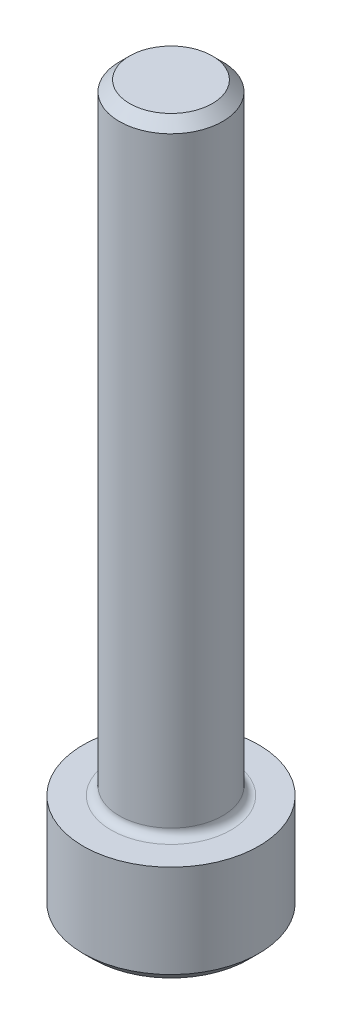
ISO-10303-21;
HEADER;
FILE_DESCRIPTION(('STEP AP214'),'2;1');
FILE_NAME('part.step','',(''),(''),'','','');
FILE_SCHEMA(('AUTOMOTIVE_DESIGN { 1 0 10303 214 1 1 1 1 }'));
ENDSEC;
DATA;
#1=APPLICATION_CONTEXT('core data for automotive mechanical design processes');
#2=APPLICATION_PROTOCOL_DEFINITION('international standard','automotive_design',2000,#1);
#3=PRODUCT_CONTEXT('',#1,'mechanical');
#4=PRODUCT('Part','Part','',(#3));
#5=PRODUCT_RELATED_PRODUCT_CATEGORY('part','',(#4));
#6=PRODUCT_DEFINITION_FORMATION('','',#4);
#7=PRODUCT_DEFINITION_CONTEXT('part definition',#1,'design');
#8=PRODUCT_DEFINITION('design','',#6,#7);
#9=PRODUCT_DEFINITION_SHAPE('','',#8);
#10=(LENGTH_UNIT() NAMED_UNIT(*) SI_UNIT(.MILLI.,.METRE.));
#11=(NAMED_UNIT(*) PLANE_ANGLE_UNIT() SI_UNIT($,.RADIAN.));
#12=(NAMED_UNIT(*) SI_UNIT($,.STERADIAN.) SOLID_ANGLE_UNIT());
#13=UNCERTAINTY_MEASURE_WITH_UNIT(LENGTH_MEASURE(1.E-05),#10,'distance_accuracy_value','');
#14=(GEOMETRIC_REPRESENTATION_CONTEXT(3) GLOBAL_UNCERTAINTY_ASSIGNED_CONTEXT((#13)) GLOBAL_UNIT_ASSIGNED_CONTEXT((#10,
#11,#12)) REPRESENTATION_CONTEXT('',''));
#15=CARTESIAN_POINT('',(0.,0.,0.));
#16=DIRECTION('',(0.,0.,1.));
#17=DIRECTION('',(1.,0.,0.));
#18=AXIS2_PLACEMENT_3D('',#15,#16,#17);
#19=CARTESIAN_POINT('',(0.,30.,0.));
#20=DIRECTION('',(0.,-1.,0.));
#21=DIRECTION('',(0.,0.,-1.));
#22=AXIS2_PLACEMENT_3D('',#19,#20,#21);
#23=CYLINDRICAL_SURFACE('',#22,2.5);
#24=CARTESIAN_POINT('',(0.,29.5,0.));
#25=DIRECTION('',(0.,1.,0.));
#26=DIRECTION('',(0.,0.,1.));
#27=AXIS2_PLACEMENT_3D('',#24,#25,#26);
#28=CIRCLE('',#27,2.5);
#29=CARTESIAN_POINT('',(0.,29.5,2.5));
#30=VERTEX_POINT('',#29);
#31=EDGE_CURVE('E11',#30,#30,#28,.F.);
#32=ORIENTED_EDGE('',*,*,#31,.T.);
#33=EDGE_LOOP('',(#32));
#34=FACE_BOUND('',#33,.T.);
#35=CARTESIAN_POINT('',(0.,0.400000000000001,0.));
#36=DIRECTION('',(0.,1.,0.));
#37=DIRECTION('',(0.,0.,1.));
#38=AXIS2_PLACEMENT_3D('',#35,#36,#37);
#39=CIRCLE('',#38,2.5);
#40=CARTESIAN_POINT('',(0.,0.400000000000001,2.5));
#41=VERTEX_POINT('',#40);
#42=EDGE_CURVE('E145',#41,#41,#39,.T.);
#43=ORIENTED_EDGE('',*,*,#42,.T.);
#44=EDGE_LOOP('',(#43));
#45=FACE_BOUND('',#44,.T.);
#46=ADVANCED_FACE('F35',(#34,#45),#23,.T.);
#47=CARTESIAN_POINT('',(0.,30.,0.));
#48=DIRECTION('',(0.,1.,0.));
#49=DIRECTION('',(0.,0.,1.));
#50=AXIS2_PLACEMENT_3D('',#47,#48,#49);
#51=PLANE('',#50);
#52=CARTESIAN_POINT('',(0.,30.,0.));
#53=DIRECTION('',(0.,1.,0.));
#54=DIRECTION('',(0.,0.,1.));
#55=AXIS2_PLACEMENT_3D('',#52,#53,#54);
#56=CIRCLE('',#55,1.99999999999999);
#57=CARTESIAN_POINT('',(0.,30.,1.99999999999999));
#58=VERTEX_POINT('',#57);
#59=EDGE_CURVE('E43',#58,#58,#56,.T.);
#60=ORIENTED_EDGE('',*,*,#59,.T.);
#61=EDGE_LOOP('',(#60));
#62=FACE_BOUND('',#61,.T.);
#63=ADVANCED_FACE('F159',(#62),#51,.T.);
#64=CARTESIAN_POINT('',(0.,-5.,0.));
#65=DIRECTION('',(0.,1.,0.));
#66=DIRECTION('',(0.,0.,1.));
#67=AXIS2_PLACEMENT_3D('',#64,#65,#66);
#68=CYLINDRICAL_SURFACE('',#67,4.25);
#69=CARTESIAN_POINT('',(0.,-4.49999999999999,0.));
#70=DIRECTION('',(0.,1.,0.));
#71=DIRECTION('',(0.,0.,1.));
#72=AXIS2_PLACEMENT_3D('',#69,#70,#71);
#73=CIRCLE('',#72,4.25);
#74=CARTESIAN_POINT('',(0.,-4.49999999999999,4.25));
#75=VERTEX_POINT('',#74);
#76=EDGE_CURVE('E151',#75,#75,#73,.T.);
#77=ORIENTED_EDGE('',*,*,#76,.T.);
#78=EDGE_LOOP('',(#77));
#79=FACE_BOUND('',#78,.T.);
#80=CARTESIAN_POINT('',(0.,0.,0.));
#81=DIRECTION('',(0.,1.,0.));
#82=DIRECTION('',(0.,0.,1.));
#83=AXIS2_PLACEMENT_3D('',#80,#81,#82);
#84=CIRCLE('',#83,4.25);
#85=CARTESIAN_POINT('',(0.,0.,4.25));
#86=VERTEX_POINT('',#85);
#87=EDGE_CURVE('E137',#86,#86,#84,.T.);
#88=ORIENTED_EDGE('',*,*,#87,.F.);
#89=EDGE_LOOP('',(#88));
#90=FACE_BOUND('',#89,.T.);
#91=ADVANCED_FACE('F180',(#79,#90),#68,.T.);
#92=CARTESIAN_POINT('',(0.,-5.,0.));
#93=DIRECTION('',(0.,1.,0.));
#94=DIRECTION('',(0.,0.,1.));
#95=AXIS2_PLACEMENT_3D('',#92,#93,#94);
#96=PLANE('',#95);
#97=DIRECTION('',(-0.866025403784439,0.,-0.5));
#98=VECTOR('',#97,1.);
#99=CARTESIAN_POINT('',(0.,-5.,2.3094010767585));
#100=LINE('',#99,#98);
#101=CARTESIAN_POINT('',(0.,-5.,2.3094010767585));
#102=VERTEX_POINT('',#101);
#103=CARTESIAN_POINT('',(-2.,-5.,1.15470053837925));
#104=VERTEX_POINT('',#103);
#105=EDGE_CURVE('E124',#102,#104,#100,.T.);
#106=ORIENTED_EDGE('',*,*,#105,.F.);
#107=DIRECTION('',(-0.866025403784439,0.,0.5));
#108=VECTOR('',#107,1.);
#109=CARTESIAN_POINT('',(2.,-5.,1.15470053837925));
#110=LINE('',#109,#108);
#111=CARTESIAN_POINT('',(2.,-5.,1.15470053837925));
#112=VERTEX_POINT('',#111);
#113=EDGE_CURVE('E50',#112,#102,#110,.T.);
#114=ORIENTED_EDGE('',*,*,#113,.F.);
#115=DIRECTION('',(0.,0.,1.));
#116=VECTOR('',#115,1.);
#117=CARTESIAN_POINT('',(2.,-5.,-1.15470053837925));
#118=LINE('',#117,#116);
#119=CARTESIAN_POINT('',(2.,-5.,-1.15470053837925));
#120=VERTEX_POINT('',#119);
#121=EDGE_CURVE('E133',#120,#112,#118,.T.);
#122=ORIENTED_EDGE('',*,*,#121,.F.);
#123=DIRECTION('',(0.866025403784439,0.,0.5));
#124=VECTOR('',#123,1.);
#125=CARTESIAN_POINT('',(0.,-5.,-2.3094010767585));
#126=LINE('',#125,#124);
#127=CARTESIAN_POINT('',(0.,-5.,-2.3094010767585));
#128=VERTEX_POINT('',#127);
#129=EDGE_CURVE('E131',#128,#120,#126,.T.);
#130=ORIENTED_EDGE('',*,*,#129,.F.);
#131=DIRECTION('',(0.866025403784439,0.,-0.5));
#132=VECTOR('',#131,1.);
#133=CARTESIAN_POINT('',(-2.,-5.,-1.15470053837925));
#134=LINE('',#133,#132);
#135=CARTESIAN_POINT('',(-2.,-5.,-1.15470053837925));
#136=VERTEX_POINT('',#135);
#137=EDGE_CURVE('E98',#136,#128,#134,.T.);
#138=ORIENTED_EDGE('',*,*,#137,.F.);
#139=DIRECTION('',(0.,0.,-1.));
#140=VECTOR('',#139,1.);
#141=CARTESIAN_POINT('',(-2.,-5.,1.15470053837925));
#142=LINE('',#141,#140);
#143=EDGE_CURVE('E127',#104,#136,#142,.T.);
#144=ORIENTED_EDGE('',*,*,#143,.F.);
#145=EDGE_LOOP('',(#106,#114,#122,#130,#138,#144));
#146=FACE_BOUND('',#145,.T.);
#147=CARTESIAN_POINT('',(0.,-5.,0.));
#148=DIRECTION('',(0.,1.,0.));
#149=DIRECTION('',(0.,0.,1.));
#150=AXIS2_PLACEMENT_3D('',#147,#148,#149);
#151=CIRCLE('',#150,3.74999999999999);
#152=CARTESIAN_POINT('',(0.,-5.,3.74999999999999));
#153=VERTEX_POINT('',#152);
#154=EDGE_CURVE('E154',#153,#153,#151,.F.);
#155=ORIENTED_EDGE('',*,*,#154,.T.);
#156=EDGE_LOOP('',(#155));
#157=FACE_BOUND('',#156,.T.);
#158=ADVANCED_FACE('F191',(#146,#157),#96,.F.);
#159=CARTESIAN_POINT('',(0.,0.,0.));
#160=DIRECTION('',(0.,1.,0.));
#161=DIRECTION('',(0.,0.,1.));
#162=AXIS2_PLACEMENT_3D('',#159,#160,#161);
#163=PLANE('',#162);
#164=CARTESIAN_POINT('',(0.,0.,0.));
#165=DIRECTION('',(0.,1.,0.));
#166=DIRECTION('',(0.,0.,1.));
#167=AXIS2_PLACEMENT_3D('',#164,#165,#166);
#168=CIRCLE('',#167,2.9);
#169=CARTESIAN_POINT('',(0.,0.,2.9));
#170=VERTEX_POINT('',#169);
#171=EDGE_CURVE('E148',#170,#170,#168,.F.);
#172=ORIENTED_EDGE('',*,*,#171,.T.);
#173=EDGE_LOOP('',(#172));
#174=FACE_BOUND('',#173,.T.);
#175=ORIENTED_EDGE('',*,*,#87,.T.);
#176=EDGE_LOOP('',(#175));
#177=FACE_BOUND('',#176,.T.);
#178=ADVANCED_FACE('F186',(#174,#177),#163,.T.);
#179=CARTESIAN_POINT('',(0.,0.400000000000001,0.));
#180=DIRECTION('',(0.,1.,0.));
#181=DIRECTION('',(0.,0.,1.));
#182=AXIS2_PLACEMENT_3D('',#179,#180,#181);
#183=TOROIDAL_SURFACE('',#182,2.9,0.4);
#184=ORIENTED_EDGE('',*,*,#171,.F.);
#185=EDGE_LOOP('',(#184));
#186=FACE_BOUND('',#185,.T.);
#187=ORIENTED_EDGE('',*,*,#42,.F.);
#188=EDGE_LOOP('',(#187));
#189=FACE_BOUND('',#188,.T.);
#190=ADVANCED_FACE('F171',(#186,#189),#183,.F.);
#191=CARTESIAN_POINT('',(0.,-4.49999999999999,0.));
#192=DIRECTION('',(0.,1.,0.));
#193=DIRECTION('',(0.,0.,1.));
#194=AXIS2_PLACEMENT_3D('',#191,#192,#193);
#195=CONICAL_SURFACE('',#194,4.25,0.785398163397449);
#196=ORIENTED_EDGE('',*,*,#154,.F.);
#197=EDGE_LOOP('',(#196));
#198=FACE_BOUND('',#197,.T.);
#199=ORIENTED_EDGE('',*,*,#76,.F.);
#200=EDGE_LOOP('',(#199));
#201=FACE_BOUND('',#200,.T.);
#202=ADVANCED_FACE('F163',(#198,#201),#195,.T.);
#203=CARTESIAN_POINT('',(0.,30.,0.));
#204=DIRECTION('',(0.,-1.,0.));
#205=DIRECTION('',(0.,0.,-1.));
#206=AXIS2_PLACEMENT_3D('',#203,#204,#205);
#207=CONICAL_SURFACE('',#206,1.99999999999999,0.78539816339745);
#208=ORIENTED_EDGE('',*,*,#31,.F.);
#209=EDGE_LOOP('',(#208));
#210=FACE_BOUND('',#209,.T.);
#211=ORIENTED_EDGE('',*,*,#59,.F.);
#212=EDGE_LOOP('',(#211));
#213=FACE_BOUND('',#212,.T.);
#214=ADVANCED_FACE('F37',(#210,#213),#207,.T.);
#215=CARTESIAN_POINT('',(2.,-2.5,1.15470053837925));
#216=DIRECTION('',(0.5,0.,0.866025403784439));
#217=DIRECTION('',(0.866025403784439,0.,-0.5));
#218=AXIS2_PLACEMENT_3D('',#215,#216,#217);
#219=PLANE('',#218);
#220=ORIENTED_EDGE('',*,*,#113,.T.);
#221=DIRECTION('',(0.,-1.,0.));
#222=VECTOR('',#221,1.);
#223=CARTESIAN_POINT('',(0.,-2.5,2.3094010767585));
#224=LINE('',#223,#222);
#225=CARTESIAN_POINT('',(0.,-2.5,2.3094010767585));
#226=VERTEX_POINT('',#225);
#227=EDGE_CURVE('E80',#226,#102,#224,.T.);
#228=ORIENTED_EDGE('',*,*,#227,.F.);
#229=DIRECTION('',(-0.866025403784439,0.,0.5));
#230=VECTOR('',#229,1.);
#231=CARTESIAN_POINT('',(2.,-2.5,1.15470053837925));
#232=LINE('',#231,#230);
#233=CARTESIAN_POINT('',(2.,-2.5,1.15470053837925));
#234=VERTEX_POINT('',#233);
#235=EDGE_CURVE('E135',#234,#226,#232,.T.);
#236=ORIENTED_EDGE('',*,*,#235,.F.);
#237=DIRECTION('',(0.,-1.,0.));
#238=VECTOR('',#237,1.);
#239=CARTESIAN_POINT('',(2.,-2.5,1.15470053837925));
#240=LINE('',#239,#238);
#241=EDGE_CURVE('E58',#234,#112,#240,.T.);
#242=ORIENTED_EDGE('',*,*,#241,.T.);
#243=EDGE_LOOP('',(#220,#228,#236,#242));
#244=FACE_BOUND('',#243,.T.);
#245=ADVANCED_FACE('F162',(#244),#219,.F.);
#246=CARTESIAN_POINT('',(2.,-2.5,-1.15470053837925));
#247=DIRECTION('',(1.,0.,0.));
#248=DIRECTION('',(0.,0.,-1.));
#249=AXIS2_PLACEMENT_3D('',#246,#247,#248);
#250=PLANE('',#249);
#251=ORIENTED_EDGE('',*,*,#121,.T.);
#252=ORIENTED_EDGE('',*,*,#241,.F.);
#253=DIRECTION('',(0.,0.,1.));
#254=VECTOR('',#253,1.);
#255=CARTESIAN_POINT('',(2.,-2.5,-1.15470053837925));
#256=LINE('',#255,#254);
#257=CARTESIAN_POINT('',(2.,-2.5,-1.15470053837925));
#258=VERTEX_POINT('',#257);
#259=EDGE_CURVE('E110',#258,#234,#256,.T.);
#260=ORIENTED_EDGE('',*,*,#259,.F.);
#261=DIRECTION('',(0.,-1.,0.));
#262=VECTOR('',#261,1.);
#263=CARTESIAN_POINT('',(2.,-2.5,-1.15470053837925));
#264=LINE('',#263,#262);
#265=EDGE_CURVE('E102',#258,#120,#264,.T.);
#266=ORIENTED_EDGE('',*,*,#265,.T.);
#267=EDGE_LOOP('',(#251,#252,#260,#266));
#268=FACE_BOUND('',#267,.T.);
#269=ADVANCED_FACE('F169',(#268),#250,.F.);
#270=CARTESIAN_POINT('',(0.,-2.5,-2.3094010767585));
#271=DIRECTION('',(0.5,0.,-0.866025403784439));
#272=DIRECTION('',(-0.866025403784439,0.,-0.5));
#273=AXIS2_PLACEMENT_3D('',#270,#271,#272);
#274=PLANE('',#273);
#275=ORIENTED_EDGE('',*,*,#129,.T.);
#276=ORIENTED_EDGE('',*,*,#265,.F.);
#277=DIRECTION('',(0.866025403784439,0.,0.5));
#278=VECTOR('',#277,1.);
#279=CARTESIAN_POINT('',(0.,-2.5,-2.3094010767585));
#280=LINE('',#279,#278);
#281=CARTESIAN_POINT('',(0.,-2.5,-2.3094010767585));
#282=VERTEX_POINT('',#281);
#283=EDGE_CURVE('E106',#282,#258,#280,.T.);
#284=ORIENTED_EDGE('',*,*,#283,.F.);
#285=DIRECTION('',(0.,-1.,0.));
#286=VECTOR('',#285,1.);
#287=CARTESIAN_POINT('',(0.,-2.5,-2.3094010767585));
#288=LINE('',#287,#286);
#289=EDGE_CURVE('E91',#282,#128,#288,.T.);
#290=ORIENTED_EDGE('',*,*,#289,.T.);
#291=EDGE_LOOP('',(#275,#276,#284,#290));
#292=FACE_BOUND('',#291,.T.);
#293=ADVANCED_FACE('F107',(#292),#274,.F.);
#294=CARTESIAN_POINT('',(-2.,-2.5,-1.15470053837925));
#295=DIRECTION('',(-0.5,0.,-0.866025403784439));
#296=DIRECTION('',(-0.866025403784439,0.,0.5));
#297=AXIS2_PLACEMENT_3D('',#294,#295,#296);
#298=PLANE('',#297);
#299=ORIENTED_EDGE('',*,*,#137,.T.);
#300=ORIENTED_EDGE('',*,*,#289,.F.);
#301=DIRECTION('',(0.866025403784439,0.,-0.5));
#302=VECTOR('',#301,1.);
#303=CARTESIAN_POINT('',(-2.,-2.5,-1.15470053837925));
#304=LINE('',#303,#302);
#305=CARTESIAN_POINT('',(-2.,-2.5,-1.15470053837925));
#306=VERTEX_POINT('',#305);
#307=EDGE_CURVE('E95',#306,#282,#304,.T.);
#308=ORIENTED_EDGE('',*,*,#307,.F.);
#309=DIRECTION('',(0.,-1.,0.));
#310=VECTOR('',#309,1.);
#311=CARTESIAN_POINT('',(-2.,-2.5,-1.15470053837925));
#312=LINE('',#311,#310);
#313=EDGE_CURVE('E103',#306,#136,#312,.T.);
#314=ORIENTED_EDGE('',*,*,#313,.T.);
#315=EDGE_LOOP('',(#299,#300,#308,#314));
#316=FACE_BOUND('',#315,.T.);
#317=ADVANCED_FACE('F93',(#316),#298,.F.);
#318=CARTESIAN_POINT('',(-2.,-2.5,1.15470053837925));
#319=DIRECTION('',(-1.,0.,0.));
#320=DIRECTION('',(0.,0.,1.));
#321=AXIS2_PLACEMENT_3D('',#318,#319,#320);
#322=PLANE('',#321);
#323=ORIENTED_EDGE('',*,*,#143,.T.);
#324=ORIENTED_EDGE('',*,*,#313,.F.);
#325=DIRECTION('',(0.,0.,-1.));
#326=VECTOR('',#325,1.);
#327=CARTESIAN_POINT('',(-2.,-2.5,1.15470053837925));
#328=LINE('',#327,#326);
#329=CARTESIAN_POINT('',(-2.,-2.5,1.15470053837925));
#330=VERTEX_POINT('',#329);
#331=EDGE_CURVE('E116',#330,#306,#328,.T.);
#332=ORIENTED_EDGE('',*,*,#331,.F.);
#333=DIRECTION('',(0.,-1.,0.));
#334=VECTOR('',#333,1.);
#335=CARTESIAN_POINT('',(-2.,-2.5,1.15470053837925));
#336=LINE('',#335,#334);
#337=EDGE_CURVE('E140',#330,#104,#336,.T.);
#338=ORIENTED_EDGE('',*,*,#337,.T.);
#339=EDGE_LOOP('',(#323,#324,#332,#338));
#340=FACE_BOUND('',#339,.T.);
#341=ADVANCED_FACE('F211',(#340),#322,.F.);
#342=CARTESIAN_POINT('',(0.,-2.5,2.3094010767585));
#343=DIRECTION('',(-0.5,0.,0.866025403784439));
#344=DIRECTION('',(0.866025403784439,0.,0.5));
#345=AXIS2_PLACEMENT_3D('',#342,#343,#344);
#346=PLANE('',#345);
#347=ORIENTED_EDGE('',*,*,#105,.T.);
#348=ORIENTED_EDGE('',*,*,#337,.F.);
#349=DIRECTION('',(-0.866025403784439,0.,-0.5));
#350=VECTOR('',#349,1.);
#351=CARTESIAN_POINT('',(0.,-2.5,2.3094010767585));
#352=LINE('',#351,#350);
#353=EDGE_CURVE('E118',#226,#330,#352,.T.);
#354=ORIENTED_EDGE('',*,*,#353,.F.);
#355=ORIENTED_EDGE('',*,*,#227,.T.);
#356=EDGE_LOOP('',(#347,#348,#354,#355));
#357=FACE_BOUND('',#356,.T.);
#358=ADVANCED_FACE('F208',(#357),#346,.F.);
#359=CARTESIAN_POINT('',(0.,-2.5,0.));
#360=DIRECTION('',(0.,-1.,0.));
#361=DIRECTION('',(0.,0.,-1.));
#362=AXIS2_PLACEMENT_3D('',#359,#360,#361);
#363=PLANE('',#362);
#364=ORIENTED_EDGE('',*,*,#235,.T.);
#365=ORIENTED_EDGE('',*,*,#353,.T.);
#366=ORIENTED_EDGE('',*,*,#331,.T.);
#367=ORIENTED_EDGE('',*,*,#307,.T.);
#368=ORIENTED_EDGE('',*,*,#283,.T.);
#369=ORIENTED_EDGE('',*,*,#259,.T.);
#370=EDGE_LOOP('',(#364,#365,#366,#367,#368,#369));
#371=FACE_BOUND('',#370,.T.);
#372=ADVANCED_FACE('F113',(#371),#363,.T.);
#373=CLOSED_SHELL('',(#46,#63,#91,#158,#178,#190,#202,#214,#245,#269,#293,#317,#341,#358,#372));
#374=MANIFOLD_SOLID_BREP('B2',#373);
#375=ADVANCED_BREP_SHAPE_REPRESENTATION('',(#18,#374),#14);
#376=SHAPE_DEFINITION_REPRESENTATION(#9,#375);
ENDSEC;
END-ISO-10303-21;
